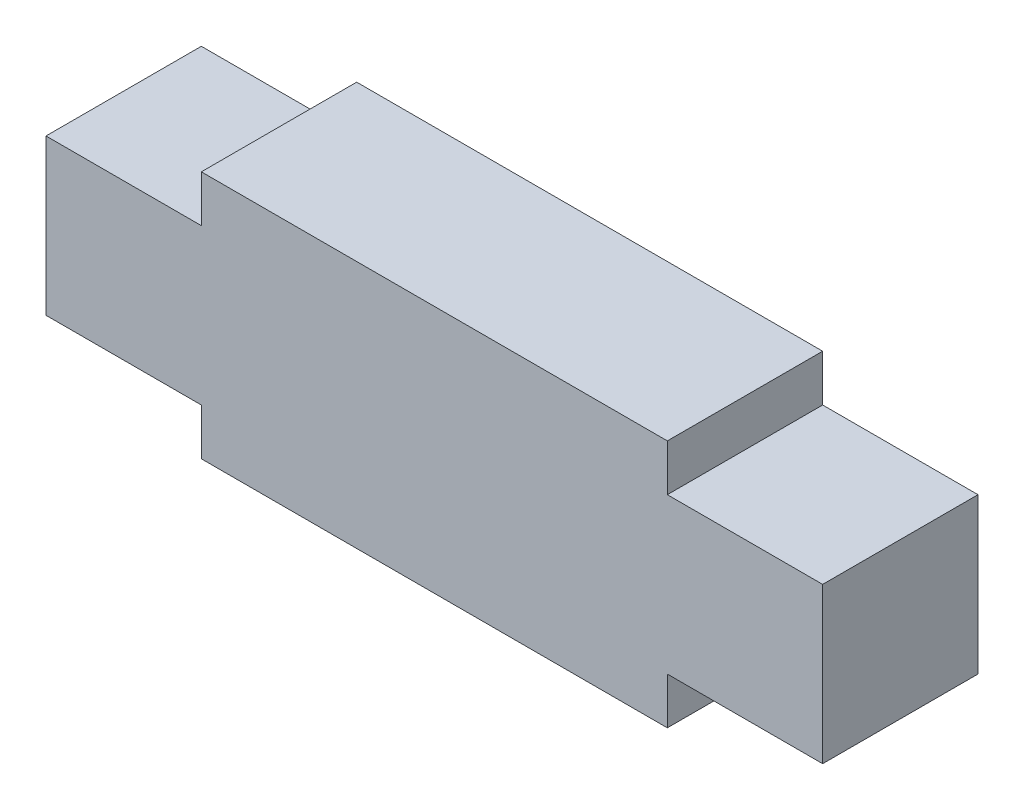
ISO-10303-21;
HEADER;
FILE_DESCRIPTION(('STEP AP214'),'2;1');
FILE_NAME('part.step','',(''),(''),'','','');
FILE_SCHEMA(('AUTOMOTIVE_DESIGN { 1 0 10303 214 1 1 1 1 }'));
ENDSEC;
DATA;
#1=APPLICATION_CONTEXT('core data for automotive mechanical design processes');
#2=APPLICATION_PROTOCOL_DEFINITION('international standard','automotive_design',2000,#1);
#3=PRODUCT_CONTEXT('',#1,'mechanical');
#4=PRODUCT('Part','Part','',(#3));
#5=PRODUCT_RELATED_PRODUCT_CATEGORY('part','',(#4));
#6=PRODUCT_DEFINITION_FORMATION('','',#4);
#7=PRODUCT_DEFINITION_CONTEXT('part definition',#1,'design');
#8=PRODUCT_DEFINITION('design','',#6,#7);
#9=PRODUCT_DEFINITION_SHAPE('','',#8);
#10=(LENGTH_UNIT() NAMED_UNIT(*) SI_UNIT(.MILLI.,.METRE.));
#11=(NAMED_UNIT(*) PLANE_ANGLE_UNIT() SI_UNIT($,.RADIAN.));
#12=(NAMED_UNIT(*) SI_UNIT($,.STERADIAN.) SOLID_ANGLE_UNIT());
#13=UNCERTAINTY_MEASURE_WITH_UNIT(LENGTH_MEASURE(1.E-05),#10,'distance_accuracy_value','');
#14=(GEOMETRIC_REPRESENTATION_CONTEXT(3) GLOBAL_UNCERTAINTY_ASSIGNED_CONTEXT((#13)) GLOBAL_UNIT_ASSIGNED_CONTEXT((#10,
#11,#12)) REPRESENTATION_CONTEXT('',''));
#15=CARTESIAN_POINT('',(0.,0.,0.));
#16=DIRECTION('',(0.,0.,1.));
#17=DIRECTION('',(1.,0.,0.));
#18=AXIS2_PLACEMENT_3D('',#15,#16,#17);
#19=CARTESIAN_POINT('',(0.,1.5,5.));
#20=DIRECTION('',(1.,0.,0.));
#21=DIRECTION('',(0.,1.,0.));
#22=AXIS2_PLACEMENT_3D('',#19,#20,#21);
#23=PLANE('',#22);
#24=DIRECTION('',(0.,-1.,0.));
#25=VECTOR('',#24,1.);
#26=CARTESIAN_POINT('',(0.,1.5,0.));
#27=LINE('',#26,#25);
#28=CARTESIAN_POINT('',(0.,1.5,0.));
#29=VERTEX_POINT('',#28);
#30=CARTESIAN_POINT('',(0.,0.,0.));
#31=VERTEX_POINT('',#30);
#32=EDGE_CURVE('E152',#29,#31,#27,.T.);
#33=ORIENTED_EDGE('',*,*,#32,.T.);
#34=DIRECTION('',(0.,0.,-1.));
#35=VECTOR('',#34,1.);
#36=CARTESIAN_POINT('',(0.,0.,5.));
#37=LINE('',#36,#35);
#38=CARTESIAN_POINT('',(0.,0.,5.));
#39=VERTEX_POINT('',#38);
#40=EDGE_CURVE('E11',#39,#31,#37,.T.);
#41=ORIENTED_EDGE('',*,*,#40,.F.);
#42=DIRECTION('',(0.,-1.,0.));
#43=VECTOR('',#42,1.);
#44=CARTESIAN_POINT('',(0.,1.5,5.));
#45=LINE('',#44,#43);
#46=CARTESIAN_POINT('',(0.,1.5,5.));
#47=VERTEX_POINT('',#46);
#48=EDGE_CURVE('E174',#47,#39,#45,.T.);
#49=ORIENTED_EDGE('',*,*,#48,.F.);
#50=DIRECTION('',(0.,0.,-1.));
#51=VECTOR('',#50,1.);
#52=CARTESIAN_POINT('',(0.,1.5,5.));
#53=LINE('',#52,#51);
#54=EDGE_CURVE('E148',#47,#29,#53,.T.);
#55=ORIENTED_EDGE('',*,*,#54,.T.);
#56=EDGE_LOOP('',(#33,#41,#49,#55));
#57=FACE_BOUND('',#56,.T.);
#58=ADVANCED_FACE('F32',(#57),#23,.F.);
#59=CARTESIAN_POINT('',(0.,0.,5.));
#60=DIRECTION('',(0.,1.,0.));
#61=DIRECTION('',(0.,0.,1.));
#62=AXIS2_PLACEMENT_3D('',#59,#60,#61);
#63=PLANE('',#62);
#64=DIRECTION('',(1.,0.,0.));
#65=VECTOR('',#64,1.);
#66=CARTESIAN_POINT('',(0.,0.,0.));
#67=LINE('',#66,#65);
#68=CARTESIAN_POINT('',(15.,0.,0.));
#69=VERTEX_POINT('',#68);
#70=EDGE_CURVE('E155',#31,#69,#67,.T.);
#71=ORIENTED_EDGE('',*,*,#70,.T.);
#72=DIRECTION('',(0.,0.,-1.));
#73=VECTOR('',#72,1.);
#74=CARTESIAN_POINT('',(15.,0.,5.));
#75=LINE('',#74,#73);
#76=CARTESIAN_POINT('',(15.,0.,5.));
#77=VERTEX_POINT('',#76);
#78=EDGE_CURVE('E40',#77,#69,#75,.T.);
#79=ORIENTED_EDGE('',*,*,#78,.F.);
#80=DIRECTION('',(1.,0.,0.));
#81=VECTOR('',#80,1.);
#82=CARTESIAN_POINT('',(0.,0.,5.));
#83=LINE('',#82,#81);
#84=EDGE_CURVE('E103',#39,#77,#83,.T.);
#85=ORIENTED_EDGE('',*,*,#84,.F.);
#86=ORIENTED_EDGE('',*,*,#40,.T.);
#87=EDGE_LOOP('',(#71,#79,#85,#86));
#88=FACE_BOUND('',#87,.T.);
#89=ADVANCED_FACE('F252',(#88),#63,.F.);
#90=CARTESIAN_POINT('',(15.,0.,5.));
#91=DIRECTION('',(-1.,0.,0.));
#92=DIRECTION('',(0.,0.,1.));
#93=AXIS2_PLACEMENT_3D('',#90,#91,#92);
#94=PLANE('',#93);
#95=DIRECTION('',(0.,1.,0.));
#96=VECTOR('',#95,1.);
#97=CARTESIAN_POINT('',(15.,0.,0.));
#98=LINE('',#97,#96);
#99=CARTESIAN_POINT('',(15.,1.5,0.));
#100=VERTEX_POINT('',#99);
#101=EDGE_CURVE('E157',#69,#100,#98,.T.);
#102=ORIENTED_EDGE('',*,*,#101,.T.);
#103=DIRECTION('',(0.,0.,-1.));
#104=VECTOR('',#103,1.);
#105=CARTESIAN_POINT('',(15.,1.5,5.));
#106=LINE('',#105,#104);
#107=CARTESIAN_POINT('',(15.,1.5,5.));
#108=VERTEX_POINT('',#107);
#109=EDGE_CURVE('E193',#108,#100,#106,.T.);
#110=ORIENTED_EDGE('',*,*,#109,.F.);
#111=DIRECTION('',(0.,1.,0.));
#112=VECTOR('',#111,1.);
#113=CARTESIAN_POINT('',(15.,0.,5.));
#114=LINE('',#113,#112);
#115=EDGE_CURVE('E201',#77,#108,#114,.T.);
#116=ORIENTED_EDGE('',*,*,#115,.F.);
#117=ORIENTED_EDGE('',*,*,#78,.T.);
#118=EDGE_LOOP('',(#102,#110,#116,#117));
#119=FACE_BOUND('',#118,.T.);
#120=ADVANCED_FACE('F199',(#119),#94,.F.);
#121=CARTESIAN_POINT('',(15.,1.5,5.));
#122=DIRECTION('',(0.,1.,0.));
#123=DIRECTION('',(0.,0.,1.));
#124=AXIS2_PLACEMENT_3D('',#121,#122,#123);
#125=PLANE('',#124);
#126=DIRECTION('',(1.,0.,0.));
#127=VECTOR('',#126,1.);
#128=CARTESIAN_POINT('',(15.,1.5,0.));
#129=LINE('',#128,#127);
#130=CARTESIAN_POINT('',(20.,1.5,0.));
#131=VERTEX_POINT('',#130);
#132=EDGE_CURVE('E159',#100,#131,#129,.T.);
#133=ORIENTED_EDGE('',*,*,#132,.T.);
#134=DIRECTION('',(0.,0.,-1.));
#135=VECTOR('',#134,1.);
#136=CARTESIAN_POINT('',(20.,1.5,5.));
#137=LINE('',#136,#135);
#138=CARTESIAN_POINT('',(20.,1.5,5.));
#139=VERTEX_POINT('',#138);
#140=EDGE_CURVE('E190',#139,#131,#137,.T.);
#141=ORIENTED_EDGE('',*,*,#140,.F.);
#142=DIRECTION('',(1.,0.,0.));
#143=VECTOR('',#142,1.);
#144=CARTESIAN_POINT('',(15.,1.5,5.));
#145=LINE('',#144,#143);
#146=EDGE_CURVE('E219',#108,#139,#145,.T.);
#147=ORIENTED_EDGE('',*,*,#146,.F.);
#148=ORIENTED_EDGE('',*,*,#109,.T.);
#149=EDGE_LOOP('',(#133,#141,#147,#148));
#150=FACE_BOUND('',#149,.T.);
#151=ADVANCED_FACE('F210',(#150),#125,.F.);
#152=CARTESIAN_POINT('',(20.,1.5,5.));
#153=DIRECTION('',(-1.,0.,0.));
#154=DIRECTION('',(0.,0.,1.));
#155=AXIS2_PLACEMENT_3D('',#152,#153,#154);
#156=PLANE('',#155);
#157=DIRECTION('',(0.,1.,0.));
#158=VECTOR('',#157,1.);
#159=CARTESIAN_POINT('',(20.,1.5,0.));
#160=LINE('',#159,#158);
#161=CARTESIAN_POINT('',(20.,6.5,0.));
#162=VERTEX_POINT('',#161);
#163=EDGE_CURVE('E161',#131,#162,#160,.T.);
#164=ORIENTED_EDGE('',*,*,#163,.T.);
#165=DIRECTION('',(0.,0.,-1.));
#166=VECTOR('',#165,1.);
#167=CARTESIAN_POINT('',(20.,6.5,5.));
#168=LINE('',#167,#166);
#169=CARTESIAN_POINT('',(20.,6.5,5.));
#170=VERTEX_POINT('',#169);
#171=EDGE_CURVE('E187',#170,#162,#168,.T.);
#172=ORIENTED_EDGE('',*,*,#171,.F.);
#173=DIRECTION('',(0.,1.,0.));
#174=VECTOR('',#173,1.);
#175=CARTESIAN_POINT('',(20.,1.5,5.));
#176=LINE('',#175,#174);
#177=EDGE_CURVE('E216',#139,#170,#176,.T.);
#178=ORIENTED_EDGE('',*,*,#177,.F.);
#179=ORIENTED_EDGE('',*,*,#140,.T.);
#180=EDGE_LOOP('',(#164,#172,#178,#179));
#181=FACE_BOUND('',#180,.T.);
#182=ADVANCED_FACE('F214',(#181),#156,.F.);
#183=CARTESIAN_POINT('',(20.,6.5,5.));
#184=DIRECTION('',(0.,-1.,0.));
#185=DIRECTION('',(1.,0.,0.));
#186=AXIS2_PLACEMENT_3D('',#183,#184,#185);
#187=PLANE('',#186);
#188=DIRECTION('',(-1.,0.,0.));
#189=VECTOR('',#188,1.);
#190=CARTESIAN_POINT('',(20.,6.5,0.));
#191=LINE('',#190,#189);
#192=CARTESIAN_POINT('',(15.,6.5,0.));
#193=VERTEX_POINT('',#192);
#194=EDGE_CURVE('E163',#162,#193,#191,.T.);
#195=ORIENTED_EDGE('',*,*,#194,.T.);
#196=DIRECTION('',(0.,0.,-1.));
#197=VECTOR('',#196,1.);
#198=CARTESIAN_POINT('',(15.,6.5,5.));
#199=LINE('',#198,#197);
#200=CARTESIAN_POINT('',(15.,6.5,5.));
#201=VERTEX_POINT('',#200);
#202=EDGE_CURVE('E184',#201,#193,#199,.T.);
#203=ORIENTED_EDGE('',*,*,#202,.F.);
#204=DIRECTION('',(-1.,0.,0.));
#205=VECTOR('',#204,1.);
#206=CARTESIAN_POINT('',(20.,6.5,5.));
#207=LINE('',#206,#205);
#208=EDGE_CURVE('E218',#170,#201,#207,.T.);
#209=ORIENTED_EDGE('',*,*,#208,.F.);
#210=ORIENTED_EDGE('',*,*,#171,.T.);
#211=EDGE_LOOP('',(#195,#203,#209,#210));
#212=FACE_BOUND('',#211,.T.);
#213=ADVANCED_FACE('F265',(#212),#187,.F.);
#214=CARTESIAN_POINT('',(15.,6.5,5.));
#215=DIRECTION('',(-1.,0.,0.));
#216=DIRECTION('',(0.,0.,1.));
#217=AXIS2_PLACEMENT_3D('',#214,#215,#216);
#218=PLANE('',#217);
#219=DIRECTION('',(0.,1.,0.));
#220=VECTOR('',#219,1.);
#221=CARTESIAN_POINT('',(15.,6.5,0.));
#222=LINE('',#221,#220);
#223=CARTESIAN_POINT('',(15.,8.,0.));
#224=VERTEX_POINT('',#223);
#225=EDGE_CURVE('E165',#193,#224,#222,.T.);
#226=ORIENTED_EDGE('',*,*,#225,.T.);
#227=DIRECTION('',(0.,0.,-1.));
#228=VECTOR('',#227,1.);
#229=CARTESIAN_POINT('',(15.,8.,5.));
#230=LINE('',#229,#228);
#231=CARTESIAN_POINT('',(15.,8.,5.));
#232=VERTEX_POINT('',#231);
#233=EDGE_CURVE('E181',#232,#224,#230,.T.);
#234=ORIENTED_EDGE('',*,*,#233,.F.);
#235=DIRECTION('',(0.,1.,0.));
#236=VECTOR('',#235,1.);
#237=CARTESIAN_POINT('',(15.,6.5,5.));
#238=LINE('',#237,#236);
#239=EDGE_CURVE('E221',#201,#232,#238,.T.);
#240=ORIENTED_EDGE('',*,*,#239,.F.);
#241=ORIENTED_EDGE('',*,*,#202,.T.);
#242=EDGE_LOOP('',(#226,#234,#240,#241));
#243=FACE_BOUND('',#242,.T.);
#244=ADVANCED_FACE('F268',(#243),#218,.F.);
#245=CARTESIAN_POINT('',(0.,8.,5.));
#246=DIRECTION('',(0.,-1.,0.));
#247=DIRECTION('',(0.,0.,-1.));
#248=AXIS2_PLACEMENT_3D('',#245,#246,#247);
#249=PLANE('',#248);
#250=DIRECTION('',(-1.,0.,0.));
#251=VECTOR('',#250,1.);
#252=CARTESIAN_POINT('',(0.,8.,0.));
#253=LINE('',#252,#251);
#254=CARTESIAN_POINT('',(0.,8.,0.));
#255=VERTEX_POINT('',#254);
#256=EDGE_CURVE('E167',#224,#255,#253,.T.);
#257=ORIENTED_EDGE('',*,*,#256,.T.);
#258=DIRECTION('',(0.,0.,-1.));
#259=VECTOR('',#258,1.);
#260=CARTESIAN_POINT('',(0.,8.,5.));
#261=LINE('',#260,#259);
#262=CARTESIAN_POINT('',(0.,8.,5.));
#263=VERTEX_POINT('',#262);
#264=EDGE_CURVE('E178',#263,#255,#261,.T.);
#265=ORIENTED_EDGE('',*,*,#264,.F.);
#266=DIRECTION('',(-1.,0.,0.));
#267=VECTOR('',#266,1.);
#268=CARTESIAN_POINT('',(0.,8.,5.));
#269=LINE('',#268,#267);
#270=EDGE_CURVE('E227',#232,#263,#269,.T.);
#271=ORIENTED_EDGE('',*,*,#270,.F.);
#272=ORIENTED_EDGE('',*,*,#233,.T.);
#273=EDGE_LOOP('',(#257,#265,#271,#272));
#274=FACE_BOUND('',#273,.T.);
#275=ADVANCED_FACE('F233',(#274),#249,.F.);
#276=CARTESIAN_POINT('',(0.,8.,5.));
#277=DIRECTION('',(1.,0.,0.));
#278=DIRECTION('',(0.,0.,-1.));
#279=AXIS2_PLACEMENT_3D('',#276,#277,#278);
#280=PLANE('',#279);
#281=DIRECTION('',(0.,-1.,0.));
#282=VECTOR('',#281,1.);
#283=CARTESIAN_POINT('',(0.,8.,0.));
#284=LINE('',#283,#282);
#285=CARTESIAN_POINT('',(0.,6.5,0.));
#286=VERTEX_POINT('',#285);
#287=EDGE_CURVE('E169',#255,#286,#284,.T.);
#288=ORIENTED_EDGE('',*,*,#287,.T.);
#289=DIRECTION('',(0.,0.,-1.));
#290=VECTOR('',#289,1.);
#291=CARTESIAN_POINT('',(0.,6.5,5.));
#292=LINE('',#291,#290);
#293=CARTESIAN_POINT('',(0.,6.5,5.));
#294=VERTEX_POINT('',#293);
#295=EDGE_CURVE('E143',#294,#286,#292,.T.);
#296=ORIENTED_EDGE('',*,*,#295,.F.);
#297=DIRECTION('',(0.,-1.,0.));
#298=VECTOR('',#297,1.);
#299=CARTESIAN_POINT('',(0.,8.,5.));
#300=LINE('',#299,#298);
#301=EDGE_CURVE('E134',#263,#294,#300,.T.);
#302=ORIENTED_EDGE('',*,*,#301,.F.);
#303=ORIENTED_EDGE('',*,*,#264,.T.);
#304=EDGE_LOOP('',(#288,#296,#302,#303));
#305=FACE_BOUND('',#304,.T.);
#306=ADVANCED_FACE('F237',(#305),#280,.F.);
#307=CARTESIAN_POINT('',(0.,6.5,5.));
#308=DIRECTION('',(0.,-1.,0.));
#309=DIRECTION('',(1.,0.,0.));
#310=AXIS2_PLACEMENT_3D('',#307,#308,#309);
#311=PLANE('',#310);
#312=DIRECTION('',(-1.,0.,0.));
#313=VECTOR('',#312,1.);
#314=CARTESIAN_POINT('',(0.,6.5,0.));
#315=LINE('',#314,#313);
#316=CARTESIAN_POINT('',(-5.,6.5,0.));
#317=VERTEX_POINT('',#316);
#318=EDGE_CURVE('E142',#286,#317,#315,.T.);
#319=ORIENTED_EDGE('',*,*,#318,.T.);
#320=DIRECTION('',(0.,0.,-1.));
#321=VECTOR('',#320,1.);
#322=CARTESIAN_POINT('',(-5.,6.5,5.));
#323=LINE('',#322,#321);
#324=CARTESIAN_POINT('',(-5.,6.5,5.));
#325=VERTEX_POINT('',#324);
#326=EDGE_CURVE('E139',#325,#317,#323,.T.);
#327=ORIENTED_EDGE('',*,*,#326,.F.);
#328=DIRECTION('',(-1.,0.,0.));
#329=VECTOR('',#328,1.);
#330=CARTESIAN_POINT('',(0.,6.5,5.));
#331=LINE('',#330,#329);
#332=EDGE_CURVE('E128',#294,#325,#331,.T.);
#333=ORIENTED_EDGE('',*,*,#332,.F.);
#334=ORIENTED_EDGE('',*,*,#295,.T.);
#335=EDGE_LOOP('',(#319,#327,#333,#334));
#336=FACE_BOUND('',#335,.T.);
#337=ADVANCED_FACE('F140',(#336),#311,.F.);
#338=CARTESIAN_POINT('',(-5.,6.5,5.));
#339=DIRECTION('',(1.,0.,0.));
#340=DIRECTION('',(0.,1.,0.));
#341=AXIS2_PLACEMENT_3D('',#338,#339,#340);
#342=PLANE('',#341);
#343=DIRECTION('',(0.,-1.,0.));
#344=VECTOR('',#343,1.);
#345=CARTESIAN_POINT('',(-5.,6.5,0.));
#346=LINE('',#345,#344);
#347=CARTESIAN_POINT('',(-5.,1.5,0.));
#348=VERTEX_POINT('',#347);
#349=EDGE_CURVE('E89',#317,#348,#346,.T.);
#350=ORIENTED_EDGE('',*,*,#349,.T.);
#351=DIRECTION('',(0.,0.,-1.));
#352=VECTOR('',#351,1.);
#353=CARTESIAN_POINT('',(-5.,1.5,5.));
#354=LINE('',#353,#352);
#355=CARTESIAN_POINT('',(-5.,1.5,5.));
#356=VERTEX_POINT('',#355);
#357=EDGE_CURVE('E144',#356,#348,#354,.T.);
#358=ORIENTED_EDGE('',*,*,#357,.F.);
#359=DIRECTION('',(0.,-1.,0.));
#360=VECTOR('',#359,1.);
#361=CARTESIAN_POINT('',(-5.,6.5,5.));
#362=LINE('',#361,#360);
#363=EDGE_CURVE('E132',#325,#356,#362,.T.);
#364=ORIENTED_EDGE('',*,*,#363,.F.);
#365=ORIENTED_EDGE('',*,*,#326,.T.);
#366=EDGE_LOOP('',(#350,#358,#364,#365));
#367=FACE_BOUND('',#366,.T.);
#368=ADVANCED_FACE('F146',(#367),#342,.F.);
#369=CARTESIAN_POINT('',(-5.,1.5,5.));
#370=DIRECTION('',(0.,1.,0.));
#371=DIRECTION('',(-1.,0.,0.));
#372=AXIS2_PLACEMENT_3D('',#369,#370,#371);
#373=PLANE('',#372);
#374=DIRECTION('',(1.,0.,0.));
#375=VECTOR('',#374,1.);
#376=CARTESIAN_POINT('',(-5.,1.5,0.));
#377=LINE('',#376,#375);
#378=EDGE_CURVE('E95',#348,#29,#377,.T.);
#379=ORIENTED_EDGE('',*,*,#378,.T.);
#380=ORIENTED_EDGE('',*,*,#54,.F.);
#381=DIRECTION('',(1.,0.,0.));
#382=VECTOR('',#381,1.);
#383=CARTESIAN_POINT('',(-5.,1.5,5.));
#384=LINE('',#383,#382);
#385=EDGE_CURVE('E48',#356,#47,#384,.T.);
#386=ORIENTED_EDGE('',*,*,#385,.F.);
#387=ORIENTED_EDGE('',*,*,#357,.T.);
#388=EDGE_LOOP('',(#379,#380,#386,#387));
#389=FACE_BOUND('',#388,.T.);
#390=ADVANCED_FACE('F241',(#389),#373,.F.);
#391=CARTESIAN_POINT('',(0.,0.,5.));
#392=DIRECTION('',(0.,0.,1.));
#393=DIRECTION('',(1.,0.,0.));
#394=AXIS2_PLACEMENT_3D('',#391,#392,#393);
#395=PLANE('',#394);
#396=ORIENTED_EDGE('',*,*,#48,.T.);
#397=ORIENTED_EDGE('',*,*,#84,.T.);
#398=ORIENTED_EDGE('',*,*,#115,.T.);
#399=ORIENTED_EDGE('',*,*,#146,.T.);
#400=ORIENTED_EDGE('',*,*,#177,.T.);
#401=ORIENTED_EDGE('',*,*,#208,.T.);
#402=ORIENTED_EDGE('',*,*,#239,.T.);
#403=ORIENTED_EDGE('',*,*,#270,.T.);
#404=ORIENTED_EDGE('',*,*,#301,.T.);
#405=ORIENTED_EDGE('',*,*,#332,.T.);
#406=ORIENTED_EDGE('',*,*,#363,.T.);
#407=ORIENTED_EDGE('',*,*,#385,.T.);
#408=EDGE_LOOP('',(#396,#397,#398,#399,#400,#401,#402,#403,#404,#405,#406,#407));
#409=FACE_BOUND('',#408,.T.);
#410=ADVANCED_FACE('F130',(#409),#395,.T.);
#411=CARTESIAN_POINT('',(0.,0.,0.));
#412=DIRECTION('',(0.,0.,1.));
#413=DIRECTION('',(1.,0.,0.));
#414=AXIS2_PLACEMENT_3D('',#411,#412,#413);
#415=PLANE('',#414);
#416=ORIENTED_EDGE('',*,*,#32,.F.);
#417=ORIENTED_EDGE('',*,*,#378,.F.);
#418=ORIENTED_EDGE('',*,*,#349,.F.);
#419=ORIENTED_EDGE('',*,*,#318,.F.);
#420=ORIENTED_EDGE('',*,*,#287,.F.);
#421=ORIENTED_EDGE('',*,*,#256,.F.);
#422=ORIENTED_EDGE('',*,*,#225,.F.);
#423=ORIENTED_EDGE('',*,*,#194,.F.);
#424=ORIENTED_EDGE('',*,*,#163,.F.);
#425=ORIENTED_EDGE('',*,*,#132,.F.);
#426=ORIENTED_EDGE('',*,*,#101,.F.);
#427=ORIENTED_EDGE('',*,*,#70,.F.);
#428=EDGE_LOOP('',(#416,#417,#418,#419,#420,#421,#422,#423,#424,#425,#426,#427));
#429=FACE_BOUND('',#428,.T.);
#430=ADVANCED_FACE('F205',(#429),#415,.F.);
#431=CLOSED_SHELL('',(#58,#89,#120,#151,#182,#213,#244,#275,#306,#337,#368,#390,#410,#430));
#432=MANIFOLD_SOLID_BREP('B2',#431);
#433=ADVANCED_BREP_SHAPE_REPRESENTATION('',(#18,#432),#14);
#434=SHAPE_DEFINITION_REPRESENTATION(#9,#433);
ENDSEC;
END-ISO-10303-21;
